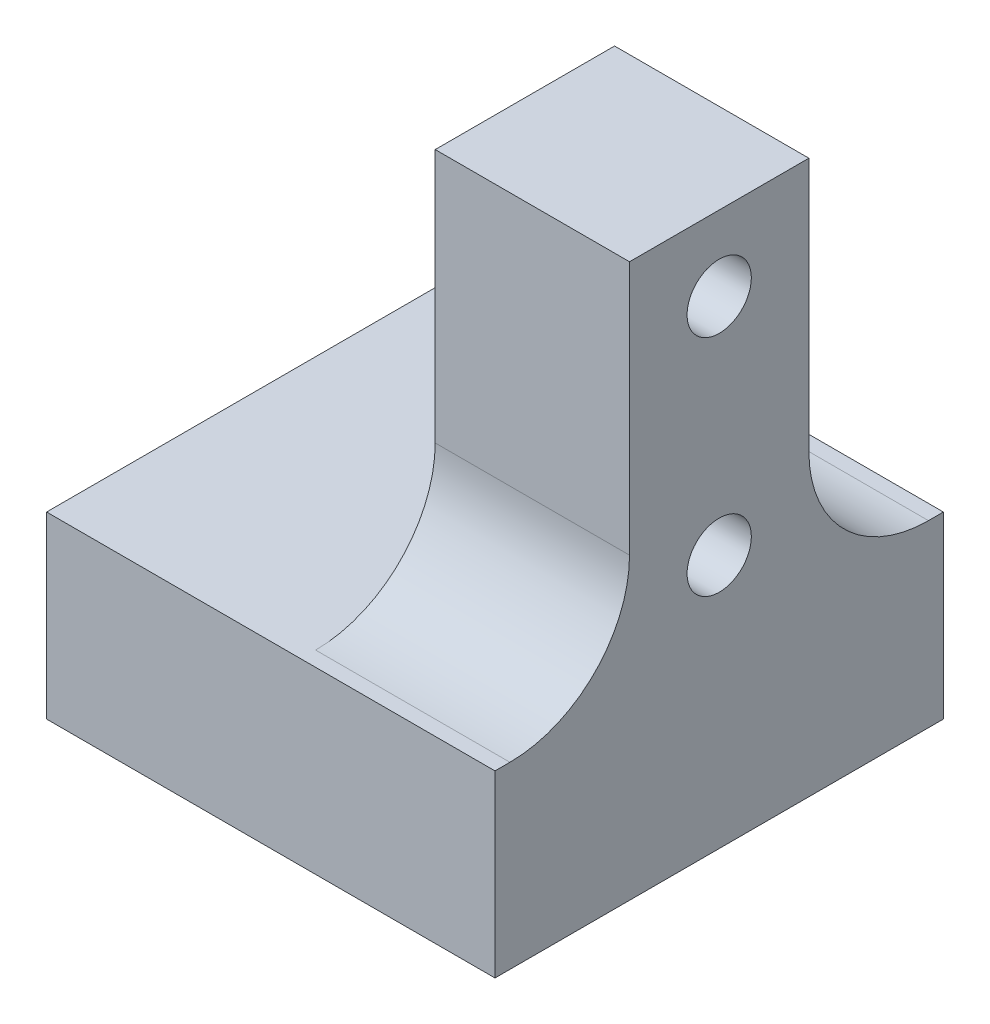
ISO-10303-21;
HEADER;
FILE_DESCRIPTION(('STEP AP214'),'2;1');
FILE_NAME('part.step','',(''),(''),'','','');
FILE_SCHEMA(('AUTOMOTIVE_DESIGN { 1 0 10303 214 1 1 1 1 }'));
ENDSEC;
DATA;
#1=APPLICATION_CONTEXT('core data for automotive mechanical design processes');
#2=APPLICATION_PROTOCOL_DEFINITION('international standard','automotive_design',2000,#1);
#3=PRODUCT_CONTEXT('',#1,'mechanical');
#4=PRODUCT('Part','Part','',(#3));
#5=PRODUCT_RELATED_PRODUCT_CATEGORY('part','',(#4));
#6=PRODUCT_DEFINITION_FORMATION('','',#4);
#7=PRODUCT_DEFINITION_CONTEXT('part definition',#1,'design');
#8=PRODUCT_DEFINITION('design','',#6,#7);
#9=PRODUCT_DEFINITION_SHAPE('','',#8);
#10=(LENGTH_UNIT() NAMED_UNIT(*) SI_UNIT(.MILLI.,.METRE.));
#11=(NAMED_UNIT(*) PLANE_ANGLE_UNIT() SI_UNIT($,.RADIAN.));
#12=(NAMED_UNIT(*) SI_UNIT($,.STERADIAN.) SOLID_ANGLE_UNIT());
#13=UNCERTAINTY_MEASURE_WITH_UNIT(LENGTH_MEASURE(1.E-05),#10,'distance_accuracy_value','');
#14=(GEOMETRIC_REPRESENTATION_CONTEXT(3) GLOBAL_UNCERTAINTY_ASSIGNED_CONTEXT((#13)) GLOBAL_UNIT_ASSIGNED_CONTEXT((#10,
#11,#12)) REPRESENTATION_CONTEXT('',''));
#15=CARTESIAN_POINT('',(0.,0.,0.));
#16=DIRECTION('',(0.,0.,1.));
#17=DIRECTION('',(1.,0.,0.));
#18=AXIS2_PLACEMENT_3D('',#15,#16,#17);
#19=CARTESIAN_POINT('',(0.,12.,0.));
#20=DIRECTION('',(0.,1.,0.));
#21=DIRECTION('',(0.,0.,1.));
#22=AXIS2_PLACEMENT_3D('',#19,#20,#21);
#23=PLANE('',#22);
#24=DIRECTION('',(0.,0.,-1.));
#25=VECTOR('',#24,1.);
#26=CARTESIAN_POINT('',(15.,12.,15.));
#27=LINE('',#26,#25);
#28=CARTESIAN_POINT('',(15.,12.,15.));
#29=VERTEX_POINT('',#28);
#30=CARTESIAN_POINT('',(15.,12.,14.));
#31=VERTEX_POINT('',#30);
#32=EDGE_CURVE('E190',#29,#31,#27,.T.);
#33=ORIENTED_EDGE('',*,*,#32,.T.);
#34=DIRECTION('',(-1.,0.,0.));
#35=VECTOR('',#34,1.);
#36=CARTESIAN_POINT('',(2.,12.,14.));
#37=LINE('',#36,#35);
#38=CARTESIAN_POINT('',(2.,12.,14.));
#39=VERTEX_POINT('',#38);
#40=EDGE_CURVE('E215',#31,#39,#37,.T.);
#41=ORIENTED_EDGE('',*,*,#40,.T.);
#42=DIRECTION('',(0.,0.,1.));
#43=VECTOR('',#42,1.);
#44=CARTESIAN_POINT('',(2.,12.,-6.));
#45=LINE('',#44,#43);
#46=CARTESIAN_POINT('',(2.,12.,-14.));
#47=VERTEX_POINT('',#46);
#48=EDGE_CURVE('E180',#47,#39,#45,.T.);
#49=ORIENTED_EDGE('',*,*,#48,.F.);
#50=DIRECTION('',(-1.,0.,0.));
#51=VECTOR('',#50,1.);
#52=CARTESIAN_POINT('',(0.,12.,-14.));
#53=LINE('',#52,#51);
#54=CARTESIAN_POINT('',(15.,12.,-14.));
#55=VERTEX_POINT('',#54);
#56=EDGE_CURVE('E214',#47,#55,#53,.F.);
#57=ORIENTED_EDGE('',*,*,#56,.T.);
#58=CARTESIAN_POINT('',(15.,12.,-15.));
#59=VERTEX_POINT('',#58);
#60=EDGE_CURVE('E187',#55,#59,#27,.T.);
#61=ORIENTED_EDGE('',*,*,#60,.T.);
#62=DIRECTION('',(-1.,0.,0.));
#63=VECTOR('',#62,1.);
#64=CARTESIAN_POINT('',(15.,12.,-15.));
#65=LINE('',#64,#63);
#66=CARTESIAN_POINT('',(-15.,12.,-15.));
#67=VERTEX_POINT('',#66);
#68=EDGE_CURVE('E188',#59,#67,#65,.T.);
#69=ORIENTED_EDGE('',*,*,#68,.T.);
#70=DIRECTION('',(0.,0.,1.));
#71=VECTOR('',#70,1.);
#72=CARTESIAN_POINT('',(-15.,12.,15.));
#73=LINE('',#72,#71);
#74=CARTESIAN_POINT('',(-15.,12.,15.));
#75=VERTEX_POINT('',#74);
#76=EDGE_CURVE('E179',#67,#75,#73,.T.);
#77=ORIENTED_EDGE('',*,*,#76,.T.);
#78=DIRECTION('',(1.,0.,0.));
#79=VECTOR('',#78,1.);
#80=CARTESIAN_POINT('',(15.,12.,15.));
#81=LINE('',#80,#79);
#82=EDGE_CURVE('E182',#75,#29,#81,.T.);
#83=ORIENTED_EDGE('',*,*,#82,.T.);
#84=EDGE_LOOP('',(#33,#41,#49,#57,#61,#69,#77,#83));
#85=FACE_BOUND('',#84,.T.);
#86=ADVANCED_FACE('F65',(#85),#23,.T.);
#87=CARTESIAN_POINT('',(-15.,12.,15.));
#88=DIRECTION('',(1.,0.,0.));
#89=DIRECTION('',(0.,0.,-1.));
#90=AXIS2_PLACEMENT_3D('',#87,#88,#89);
#91=PLANE('',#90);
#92=DIRECTION('',(0.,0.,1.));
#93=VECTOR('',#92,1.);
#94=CARTESIAN_POINT('',(-15.,0.,15.));
#95=LINE('',#94,#93);
#96=CARTESIAN_POINT('',(-15.,0.,-15.));
#97=VERTEX_POINT('',#96);
#98=CARTESIAN_POINT('',(-15.,0.,15.));
#99=VERTEX_POINT('',#98);
#100=EDGE_CURVE('E154',#97,#99,#95,.T.);
#101=ORIENTED_EDGE('',*,*,#100,.T.);
#102=DIRECTION('',(0.,-1.,0.));
#103=VECTOR('',#102,1.);
#104=CARTESIAN_POINT('',(-15.,12.,15.));
#105=LINE('',#104,#103);
#106=EDGE_CURVE('E206',#75,#99,#105,.T.);
#107=ORIENTED_EDGE('',*,*,#106,.F.);
#108=ORIENTED_EDGE('',*,*,#76,.F.);
#109=DIRECTION('',(0.,-1.,0.));
#110=VECTOR('',#109,1.);
#111=CARTESIAN_POINT('',(-15.,12.,-15.));
#112=LINE('',#111,#110);
#113=EDGE_CURVE('E191',#67,#97,#112,.T.);
#114=ORIENTED_EDGE('',*,*,#113,.T.);
#115=EDGE_LOOP('',(#101,#107,#108,#114));
#116=FACE_BOUND('',#115,.T.);
#117=ADVANCED_FACE('F255',(#116),#91,.F.);
#118=CARTESIAN_POINT('',(15.,12.,15.));
#119=DIRECTION('',(0.,0.,-1.));
#120=DIRECTION('',(-1.,0.,0.));
#121=AXIS2_PLACEMENT_3D('',#118,#119,#120);
#122=PLANE('',#121);
#123=DIRECTION('',(1.,0.,0.));
#124=VECTOR('',#123,1.);
#125=CARTESIAN_POINT('',(15.,0.,15.));
#126=LINE('',#125,#124);
#127=CARTESIAN_POINT('',(15.,0.,15.));
#128=VERTEX_POINT('',#127);
#129=EDGE_CURVE('E192',#99,#128,#126,.T.);
#130=ORIENTED_EDGE('',*,*,#129,.T.);
#131=DIRECTION('',(0.,-1.,0.));
#132=VECTOR('',#131,1.);
#133=CARTESIAN_POINT('',(15.,12.,15.));
#134=LINE('',#133,#132);
#135=EDGE_CURVE('E201',#29,#128,#134,.T.);
#136=ORIENTED_EDGE('',*,*,#135,.F.);
#137=ORIENTED_EDGE('',*,*,#82,.F.);
#138=ORIENTED_EDGE('',*,*,#106,.T.);
#139=EDGE_LOOP('',(#130,#136,#137,#138));
#140=FACE_BOUND('',#139,.T.);
#141=ADVANCED_FACE('F239',(#140),#122,.F.);
#142=CARTESIAN_POINT('',(15.,12.,15.));
#143=DIRECTION('',(-1.,0.,0.));
#144=DIRECTION('',(0.,0.,1.));
#145=AXIS2_PLACEMENT_3D('',#142,#143,#144);
#146=PLANE('',#145);
#147=CARTESIAN_POINT('',(15.,17.,0.));
#148=DIRECTION('',(1.,0.,0.));
#149=DIRECTION('',(0.,0.,-1.));
#150=AXIS2_PLACEMENT_3D('',#147,#148,#149);
#151=CIRCLE('',#150,2.15);
#152=CARTESIAN_POINT('',(15.,17.,-2.15));
#153=VERTEX_POINT('',#152);
#154=EDGE_CURVE('E221',#153,#153,#151,.T.);
#155=ORIENTED_EDGE('',*,*,#154,.F.);
#156=EDGE_LOOP('',(#155));
#157=FACE_BOUND('',#156,.T.);
#158=CARTESIAN_POINT('',(15.,32.,0.));
#159=DIRECTION('',(1.,0.,0.));
#160=DIRECTION('',(0.,0.,-1.));
#161=AXIS2_PLACEMENT_3D('',#158,#159,#160);
#162=CIRCLE('',#161,2.15);
#163=CARTESIAN_POINT('',(15.,32.,-2.15));
#164=VERTEX_POINT('',#163);
#165=EDGE_CURVE('E171',#164,#164,#162,.T.);
#166=ORIENTED_EDGE('',*,*,#165,.F.);
#167=EDGE_LOOP('',(#166));
#168=FACE_BOUND('',#167,.T.);
#169=DIRECTION('',(0.,0.,-1.));
#170=VECTOR('',#169,1.);
#171=CARTESIAN_POINT('',(15.,0.,15.));
#172=LINE('',#171,#170);
#173=CARTESIAN_POINT('',(15.,0.,-15.));
#174=VERTEX_POINT('',#173);
#175=EDGE_CURVE('E199',#128,#174,#172,.T.);
#176=ORIENTED_EDGE('',*,*,#175,.T.);
#177=DIRECTION('',(0.,-1.,0.));
#178=VECTOR('',#177,1.);
#179=CARTESIAN_POINT('',(15.,12.,-15.));
#180=LINE('',#179,#178);
#181=EDGE_CURVE('E205',#59,#174,#180,.T.);
#182=ORIENTED_EDGE('',*,*,#181,.F.);
#183=ORIENTED_EDGE('',*,*,#60,.F.);
#184=CARTESIAN_POINT('',(15.,20.,-14.));
#185=DIRECTION('',(-1.,0.,0.));
#186=DIRECTION('',(0.,0.,1.));
#187=AXIS2_PLACEMENT_3D('',#184,#185,#186);
#188=CIRCLE('',#187,8.);
#189=CARTESIAN_POINT('',(15.,20.,-6.));
#190=VERTEX_POINT('',#189);
#191=EDGE_CURVE('E12',#55,#190,#188,.T.);
#192=ORIENTED_EDGE('',*,*,#191,.T.);
#193=DIRECTION('',(0.,-1.,0.));
#194=VECTOR('',#193,1.);
#195=CARTESIAN_POINT('',(15.,37.,-6.));
#196=LINE('',#195,#194);
#197=CARTESIAN_POINT('',(15.,37.,-6.));
#198=VERTEX_POINT('',#197);
#199=EDGE_CURVE('E155',#198,#190,#196,.T.);
#200=ORIENTED_EDGE('',*,*,#199,.F.);
#201=DIRECTION('',(0.,0.,-1.));
#202=VECTOR('',#201,1.);
#203=CARTESIAN_POINT('',(15.,37.,0.));
#204=LINE('',#203,#202);
#205=CARTESIAN_POINT('',(15.,37.,6.));
#206=VERTEX_POINT('',#205);
#207=EDGE_CURVE('E153',#206,#198,#204,.T.);
#208=ORIENTED_EDGE('',*,*,#207,.F.);
#209=DIRECTION('',(0.,-1.,0.));
#210=VECTOR('',#209,1.);
#211=CARTESIAN_POINT('',(15.,37.,6.));
#212=LINE('',#211,#210);
#213=CARTESIAN_POINT('',(15.,20.,6.));
#214=VERTEX_POINT('',#213);
#215=EDGE_CURVE('E145',#206,#214,#212,.T.);
#216=ORIENTED_EDGE('',*,*,#215,.T.);
#217=CARTESIAN_POINT('',(15.,20.,14.));
#218=DIRECTION('',(-1.,0.,0.));
#219=DIRECTION('',(0.,0.,1.));
#220=AXIS2_PLACEMENT_3D('',#217,#218,#219);
#221=CIRCLE('',#220,8.);
#222=EDGE_CURVE('E222',#214,#31,#221,.T.);
#223=ORIENTED_EDGE('',*,*,#222,.T.);
#224=ORIENTED_EDGE('',*,*,#32,.F.);
#225=ORIENTED_EDGE('',*,*,#135,.T.);
#226=EDGE_LOOP('',(#176,#182,#183,#192,#200,#208,#216,#223,#224,#225));
#227=FACE_BOUND('',#226,.T.);
#228=ADVANCED_FACE('F157',(#157,#168,#227),#146,.F.);
#229=CARTESIAN_POINT('',(15.,12.,-15.));
#230=DIRECTION('',(0.,0.,1.));
#231=DIRECTION('',(1.,0.,0.));
#232=AXIS2_PLACEMENT_3D('',#229,#230,#231);
#233=PLANE('',#232);
#234=DIRECTION('',(-1.,0.,0.));
#235=VECTOR('',#234,1.);
#236=CARTESIAN_POINT('',(15.,0.,-15.));
#237=LINE('',#236,#235);
#238=EDGE_CURVE('E183',#174,#97,#237,.T.);
#239=ORIENTED_EDGE('',*,*,#238,.T.);
#240=ORIENTED_EDGE('',*,*,#113,.F.);
#241=ORIENTED_EDGE('',*,*,#68,.F.);
#242=ORIENTED_EDGE('',*,*,#181,.T.);
#243=EDGE_LOOP('',(#239,#240,#241,#242));
#244=FACE_BOUND('',#243,.T.);
#245=ADVANCED_FACE('F237',(#244),#233,.F.);
#246=CARTESIAN_POINT('',(0.,0.,0.));
#247=DIRECTION('',(0.,1.,0.));
#248=DIRECTION('',(0.,0.,1.));
#249=AXIS2_PLACEMENT_3D('',#246,#247,#248);
#250=PLANE('',#249);
#251=ORIENTED_EDGE('',*,*,#100,.F.);
#252=ORIENTED_EDGE('',*,*,#238,.F.);
#253=ORIENTED_EDGE('',*,*,#175,.F.);
#254=ORIENTED_EDGE('',*,*,#129,.F.);
#255=EDGE_LOOP('',(#251,#252,#253,#254));
#256=FACE_BOUND('',#255,.T.);
#257=ADVANCED_FACE('F247',(#256),#250,.F.);
#258=CARTESIAN_POINT('',(0.,37.,6.));
#259=DIRECTION('',(0.,0.,1.));
#260=DIRECTION('',(1.,0.,0.));
#261=AXIS2_PLACEMENT_3D('',#258,#259,#260);
#262=PLANE('',#261);
#263=DIRECTION('',(0.,-1.,0.));
#264=VECTOR('',#263,1.);
#265=CARTESIAN_POINT('',(2.,37.,6.));
#266=LINE('',#265,#264);
#267=CARTESIAN_POINT('',(2.,37.,6.));
#268=VERTEX_POINT('',#267);
#269=CARTESIAN_POINT('',(2.,20.,6.));
#270=VERTEX_POINT('',#269);
#271=EDGE_CURVE('E166',#268,#270,#266,.T.);
#272=ORIENTED_EDGE('',*,*,#271,.T.);
#273=DIRECTION('',(-1.,0.,0.));
#274=VECTOR('',#273,1.);
#275=CARTESIAN_POINT('',(15.,20.,6.));
#276=LINE('',#275,#274);
#277=EDGE_CURVE('E147',#270,#214,#276,.F.);
#278=ORIENTED_EDGE('',*,*,#277,.T.);
#279=ORIENTED_EDGE('',*,*,#215,.F.);
#280=DIRECTION('',(-1.,0.,0.));
#281=VECTOR('',#280,1.);
#282=CARTESIAN_POINT('',(0.,37.,6.));
#283=LINE('',#282,#281);
#284=EDGE_CURVE('E146',#206,#268,#283,.T.);
#285=ORIENTED_EDGE('',*,*,#284,.T.);
#286=EDGE_LOOP('',(#272,#278,#279,#285));
#287=FACE_BOUND('',#286,.T.);
#288=ADVANCED_FACE('F143',(#287),#262,.T.);
#289=CARTESIAN_POINT('',(0.,37.,-6.));
#290=DIRECTION('',(0.,0.,1.));
#291=DIRECTION('',(1.,0.,0.));
#292=AXIS2_PLACEMENT_3D('',#289,#290,#291);
#293=PLANE('',#292);
#294=ORIENTED_EDGE('',*,*,#199,.T.);
#295=DIRECTION('',(-1.,0.,0.));
#296=VECTOR('',#295,1.);
#297=CARTESIAN_POINT('',(0.,20.,-6.));
#298=LINE('',#297,#296);
#299=CARTESIAN_POINT('',(2.,20.,-6.));
#300=VERTEX_POINT('',#299);
#301=EDGE_CURVE('E219',#190,#300,#298,.T.);
#302=ORIENTED_EDGE('',*,*,#301,.T.);
#303=DIRECTION('',(0.,-1.,0.));
#304=VECTOR('',#303,1.);
#305=CARTESIAN_POINT('',(2.,37.,-6.));
#306=LINE('',#305,#304);
#307=CARTESIAN_POINT('',(2.,37.,-6.));
#308=VERTEX_POINT('',#307);
#309=EDGE_CURVE('E164',#308,#300,#306,.T.);
#310=ORIENTED_EDGE('',*,*,#309,.F.);
#311=DIRECTION('',(-1.,0.,0.));
#312=VECTOR('',#311,1.);
#313=CARTESIAN_POINT('',(0.,37.,-6.));
#314=LINE('',#313,#312);
#315=EDGE_CURVE('E159',#198,#308,#314,.T.);
#316=ORIENTED_EDGE('',*,*,#315,.F.);
#317=EDGE_LOOP('',(#294,#302,#310,#316));
#318=FACE_BOUND('',#317,.T.);
#319=ADVANCED_FACE('F271',(#318),#293,.F.);
#320=CARTESIAN_POINT('',(0.,37.,0.));
#321=DIRECTION('',(0.,1.,0.));
#322=DIRECTION('',(0.,0.,1.));
#323=AXIS2_PLACEMENT_3D('',#320,#321,#322);
#324=PLANE('',#323);
#325=ORIENTED_EDGE('',*,*,#315,.T.);
#326=DIRECTION('',(0.,0.,1.));
#327=VECTOR('',#326,1.);
#328=CARTESIAN_POINT('',(2.,37.,-6.));
#329=LINE('',#328,#327);
#330=EDGE_CURVE('E161',#308,#268,#329,.T.);
#331=ORIENTED_EDGE('',*,*,#330,.T.);
#332=ORIENTED_EDGE('',*,*,#284,.F.);
#333=ORIENTED_EDGE('',*,*,#207,.T.);
#334=EDGE_LOOP('',(#325,#331,#332,#333));
#335=FACE_BOUND('',#334,.T.);
#336=ADVANCED_FACE('F163',(#335),#324,.T.);
#337=CARTESIAN_POINT('',(2.,37.,-6.));
#338=DIRECTION('',(1.,0.,0.));
#339=DIRECTION('',(0.,0.,-1.));
#340=AXIS2_PLACEMENT_3D('',#337,#338,#339);
#341=PLANE('',#340);
#342=CARTESIAN_POINT('',(2.,17.,0.));
#343=DIRECTION('',(1.,0.,0.));
#344=DIRECTION('',(0.,0.,-1.));
#345=AXIS2_PLACEMENT_3D('',#342,#343,#344);
#346=CIRCLE('',#345,2.15);
#347=CARTESIAN_POINT('',(2.,17.,-2.15));
#348=VERTEX_POINT('',#347);
#349=EDGE_CURVE('E69',#348,#348,#346,.T.);
#350=ORIENTED_EDGE('',*,*,#349,.T.);
#351=EDGE_LOOP('',(#350));
#352=FACE_BOUND('',#351,.T.);
#353=CARTESIAN_POINT('',(2.,32.,0.));
#354=DIRECTION('',(1.,0.,0.));
#355=DIRECTION('',(0.,0.,-1.));
#356=AXIS2_PLACEMENT_3D('',#353,#354,#355);
#357=CIRCLE('',#356,2.15);
#358=CARTESIAN_POINT('',(2.,32.,-2.15));
#359=VERTEX_POINT('',#358);
#360=EDGE_CURVE('E223',#359,#359,#357,.T.);
#361=ORIENTED_EDGE('',*,*,#360,.T.);
#362=EDGE_LOOP('',(#361));
#363=FACE_BOUND('',#362,.T.);
#364=ORIENTED_EDGE('',*,*,#48,.T.);
#365=CARTESIAN_POINT('',(2.,20.,14.));
#366=DIRECTION('',(1.,0.,0.));
#367=DIRECTION('',(0.,0.,-1.));
#368=AXIS2_PLACEMENT_3D('',#365,#366,#367);
#369=CIRCLE('',#368,8.);
#370=EDGE_CURVE('E216',#39,#270,#369,.T.);
#371=ORIENTED_EDGE('',*,*,#370,.T.);
#372=ORIENTED_EDGE('',*,*,#271,.F.);
#373=ORIENTED_EDGE('',*,*,#330,.F.);
#374=ORIENTED_EDGE('',*,*,#309,.T.);
#375=CARTESIAN_POINT('',(2.,20.,-14.));
#376=DIRECTION('',(1.,0.,0.));
#377=DIRECTION('',(0.,0.,-1.));
#378=AXIS2_PLACEMENT_3D('',#375,#376,#377);
#379=CIRCLE('',#378,8.);
#380=EDGE_CURVE('E75',#300,#47,#379,.T.);
#381=ORIENTED_EDGE('',*,*,#380,.T.);
#382=EDGE_LOOP('',(#364,#371,#372,#373,#374,#381));
#383=FACE_BOUND('',#382,.T.);
#384=ADVANCED_FACE('F270',(#352,#363,#383),#341,.F.);
#385=CARTESIAN_POINT('',(0.,20.,14.));
#386=DIRECTION('',(1.,0.,0.));
#387=DIRECTION('',(0.,0.,-1.));
#388=AXIS2_PLACEMENT_3D('',#385,#386,#387);
#389=CYLINDRICAL_SURFACE('',#388,8.);
#390=ORIENTED_EDGE('',*,*,#222,.F.);
#391=ORIENTED_EDGE('',*,*,#277,.F.);
#392=ORIENTED_EDGE('',*,*,#370,.F.);
#393=ORIENTED_EDGE('',*,*,#40,.F.);
#394=EDGE_LOOP('',(#390,#391,#392,#393));
#395=FACE_BOUND('',#394,.T.);
#396=ADVANCED_FACE('F273',(#395),#389,.F.);
#397=CARTESIAN_POINT('',(0.,20.,-14.));
#398=DIRECTION('',(-1.,0.,0.));
#399=DIRECTION('',(0.,0.,1.));
#400=AXIS2_PLACEMENT_3D('',#397,#398,#399);
#401=CYLINDRICAL_SURFACE('',#400,8.);
#402=ORIENTED_EDGE('',*,*,#191,.F.);
#403=ORIENTED_EDGE('',*,*,#56,.F.);
#404=ORIENTED_EDGE('',*,*,#380,.F.);
#405=ORIENTED_EDGE('',*,*,#301,.F.);
#406=EDGE_LOOP('',(#402,#403,#404,#405));
#407=FACE_BOUND('',#406,.T.);
#408=ADVANCED_FACE('F62',(#407),#401,.F.);
#409=CARTESIAN_POINT('',(-15.,32.,0.));
#410=DIRECTION('',(1.,0.,0.));
#411=DIRECTION('',(0.,0.,-1.));
#412=AXIS2_PLACEMENT_3D('',#409,#410,#411);
#413=CYLINDRICAL_SURFACE('',#412,2.15);
#414=ORIENTED_EDGE('',*,*,#165,.T.);
#415=EDGE_LOOP('',(#414));
#416=FACE_BOUND('',#415,.T.);
#417=ORIENTED_EDGE('',*,*,#360,.F.);
#418=EDGE_LOOP('',(#417));
#419=FACE_BOUND('',#418,.T.);
#420=ADVANCED_FACE('F232',(#416,#419),#413,.F.);
#421=CARTESIAN_POINT('',(-15.,17.,0.));
#422=DIRECTION('',(1.,0.,0.));
#423=DIRECTION('',(0.,0.,-1.));
#424=AXIS2_PLACEMENT_3D('',#421,#422,#423);
#425=CYLINDRICAL_SURFACE('',#424,2.15);
#426=ORIENTED_EDGE('',*,*,#154,.T.);
#427=EDGE_LOOP('',(#426));
#428=FACE_BOUND('',#427,.T.);
#429=ORIENTED_EDGE('',*,*,#349,.F.);
#430=EDGE_LOOP('',(#429));
#431=FACE_BOUND('',#430,.T.);
#432=ADVANCED_FACE('F302',(#428,#431),#425,.F.);
#433=CLOSED_SHELL('',(#86,#117,#141,#228,#245,#257,#288,#319,#336,#384,#396,#408,#420,#432));
#434=MANIFOLD_SOLID_BREP('B2',#433);
#435=ADVANCED_BREP_SHAPE_REPRESENTATION('',(#18,#434),#14);
#436=SHAPE_DEFINITION_REPRESENTATION(#9,#435);
ENDSEC;
END-ISO-10303-21;
